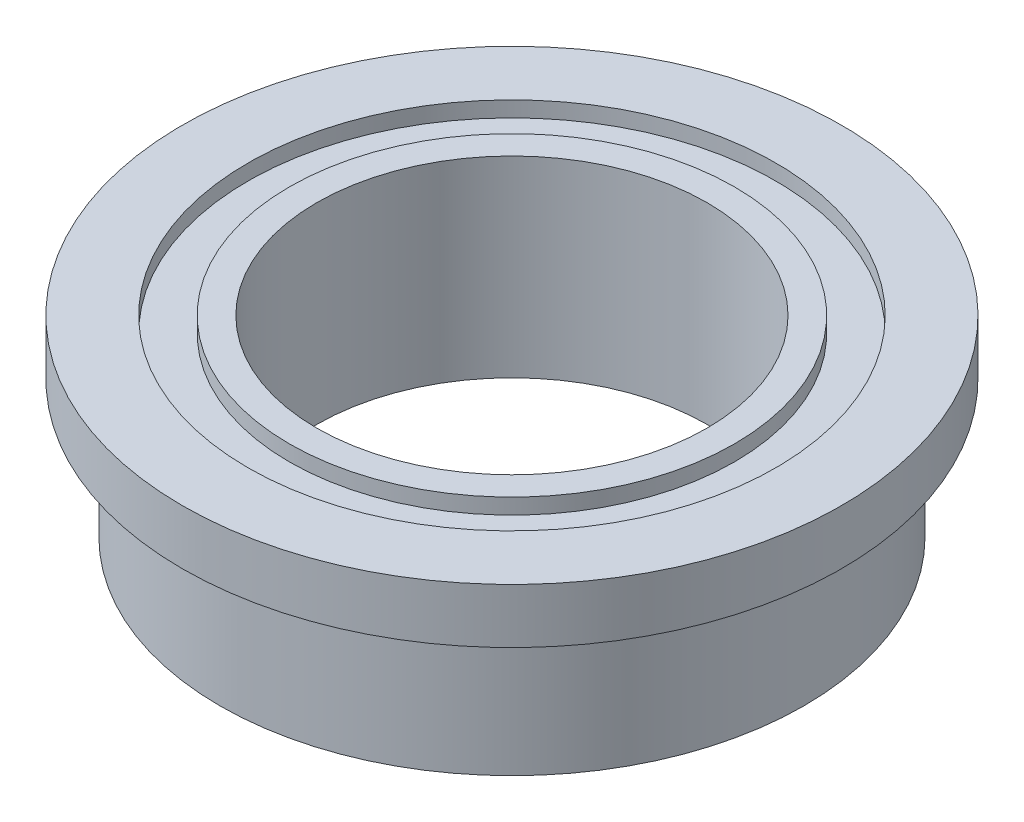
ISO-10303-21;
HEADER;
FILE_DESCRIPTION(('STEP AP214'),'2;1');
FILE_NAME('part.step','',(''),(''),'','','');
FILE_SCHEMA(('AUTOMOTIVE_DESIGN { 1 0 10303 214 1 1 1 1 }'));
ENDSEC;
DATA;
#1=APPLICATION_CONTEXT('core data for automotive mechanical design processes');
#2=APPLICATION_PROTOCOL_DEFINITION('international standard','automotive_design',2000,#1);
#3=PRODUCT_CONTEXT('',#1,'mechanical');
#4=PRODUCT('Part','Part','',(#3));
#5=PRODUCT_RELATED_PRODUCT_CATEGORY('part','',(#4));
#6=PRODUCT_DEFINITION_FORMATION('','',#4);
#7=PRODUCT_DEFINITION_CONTEXT('part definition',#1,'design');
#8=PRODUCT_DEFINITION('design','',#6,#7);
#9=PRODUCT_DEFINITION_SHAPE('','',#8);
#10=(LENGTH_UNIT() NAMED_UNIT(*) SI_UNIT(.MILLI.,.METRE.));
#11=(NAMED_UNIT(*) PLANE_ANGLE_UNIT() SI_UNIT($,.RADIAN.));
#12=(NAMED_UNIT(*) SI_UNIT($,.STERADIAN.) SOLID_ANGLE_UNIT());
#13=UNCERTAINTY_MEASURE_WITH_UNIT(LENGTH_MEASURE(1.E-05),#10,'distance_accuracy_value','');
#14=(GEOMETRIC_REPRESENTATION_CONTEXT(3) GLOBAL_UNCERTAINTY_ASSIGNED_CONTEXT((#13)) GLOBAL_UNIT_ASSIGNED_CONTEXT((#10,
#11,#12)) REPRESENTATION_CONTEXT('',''));
#15=CARTESIAN_POINT('',(0.,0.,0.));
#16=DIRECTION('',(0.,0.,1.));
#17=DIRECTION('',(1.,0.,0.));
#18=AXIS2_PLACEMENT_3D('',#15,#16,#17);
#19=CARTESIAN_POINT('',(0.,0.,0.));
#20=DIRECTION('',(0.,1.,0.));
#21=DIRECTION('',(0.,0.,1.));
#22=AXIS2_PLACEMENT_3D('',#19,#20,#21);
#23=CYLINDRICAL_SURFACE('',#22,3.175);
#24=CARTESIAN_POINT('',(0.,3.1242,0.));
#25=DIRECTION('',(0.,1.,0.));
#26=DIRECTION('',(0.,0.,1.));
#27=AXIS2_PLACEMENT_3D('',#24,#25,#26);
#28=CIRCLE('',#27,3.175);
#29=CARTESIAN_POINT('',(0.,3.1242,3.175));
#30=VERTEX_POINT('',#29);
#31=EDGE_CURVE('E10',#30,#30,#28,.T.);
#32=ORIENTED_EDGE('',*,*,#31,.T.);
#33=EDGE_LOOP('',(#32));
#34=FACE_BOUND('',#33,.T.);
#35=CARTESIAN_POINT('',(0.,0.,0.));
#36=DIRECTION('',(0.,1.,0.));
#37=DIRECTION('',(0.,0.,1.));
#38=AXIS2_PLACEMENT_3D('',#35,#36,#37);
#39=CIRCLE('',#38,3.175);
#40=CARTESIAN_POINT('',(0.,0.,3.175));
#41=VERTEX_POINT('',#40);
#42=EDGE_CURVE('E79',#41,#41,#39,.T.);
#43=ORIENTED_EDGE('',*,*,#42,.F.);
#44=EDGE_LOOP('',(#43));
#45=FACE_BOUND('',#44,.T.);
#46=ADVANCED_FACE('F33',(#34,#45),#23,.F.);
#47=CARTESIAN_POINT('',(3.175,3.1242,0.));
#48=DIRECTION('',(0.,1.,0.));
#49=DIRECTION('',(0.,0.,1.));
#50=AXIS2_PLACEMENT_3D('',#47,#48,#49);
#51=PLANE('',#50);
#52=CARTESIAN_POINT('',(0.,3.1242,0.));
#53=DIRECTION('',(0.,1.,0.));
#54=DIRECTION('',(0.,0.,1.));
#55=AXIS2_PLACEMENT_3D('',#52,#53,#54);
#56=CIRCLE('',#55,3.6195);
#57=CARTESIAN_POINT('',(0.,3.1242,3.6195));
#58=VERTEX_POINT('',#57);
#59=EDGE_CURVE('E39',#58,#58,#56,.T.);
#60=ORIENTED_EDGE('',*,*,#59,.T.);
#61=EDGE_LOOP('',(#60));
#62=FACE_BOUND('',#61,.T.);
#63=ORIENTED_EDGE('',*,*,#31,.F.);
#64=EDGE_LOOP('',(#63));
#65=FACE_BOUND('',#64,.T.);
#66=ADVANCED_FACE('F87',(#62,#65),#51,.T.);
#67=CARTESIAN_POINT('',(0.,0.,0.));
#68=DIRECTION('',(0.,1.,0.));
#69=DIRECTION('',(0.,0.,1.));
#70=AXIS2_PLACEMENT_3D('',#67,#68,#69);
#71=CYLINDRICAL_SURFACE('',#70,3.6195);
#72=CARTESIAN_POINT('',(0.,2.8702,0.));
#73=DIRECTION('',(0.,1.,0.));
#74=DIRECTION('',(0.,0.,1.));
#75=AXIS2_PLACEMENT_3D('',#72,#73,#74);
#76=CIRCLE('',#75,3.6195);
#77=CARTESIAN_POINT('',(0.,2.8702,3.6195));
#78=VERTEX_POINT('',#77);
#79=EDGE_CURVE('E43',#78,#78,#76,.T.);
#80=ORIENTED_EDGE('',*,*,#79,.T.);
#81=EDGE_LOOP('',(#80));
#82=FACE_BOUND('',#81,.T.);
#83=ORIENTED_EDGE('',*,*,#59,.F.);
#84=EDGE_LOOP('',(#83));
#85=FACE_BOUND('',#84,.T.);
#86=ADVANCED_FACE('F91',(#82,#85),#71,.T.);
#87=CARTESIAN_POINT('',(3.6195,2.8702,0.));
#88=DIRECTION('',(0.,1.,0.));
#89=DIRECTION('',(0.,0.,1.));
#90=AXIS2_PLACEMENT_3D('',#87,#88,#89);
#91=PLANE('',#90);
#92=CARTESIAN_POINT('',(0.,2.8702,0.));
#93=DIRECTION('',(0.,1.,0.));
#94=DIRECTION('',(0.,0.,1.));
#95=AXIS2_PLACEMENT_3D('',#92,#93,#94);
#96=CIRCLE('',#95,4.2926);
#97=CARTESIAN_POINT('',(0.,2.8702,4.2926));
#98=VERTEX_POINT('',#97);
#99=EDGE_CURVE('E47',#98,#98,#96,.T.);
#100=ORIENTED_EDGE('',*,*,#99,.T.);
#101=EDGE_LOOP('',(#100));
#102=FACE_BOUND('',#101,.T.);
#103=ORIENTED_EDGE('',*,*,#79,.F.);
#104=EDGE_LOOP('',(#103));
#105=FACE_BOUND('',#104,.T.);
#106=ADVANCED_FACE('F95',(#102,#105),#91,.T.);
#107=CARTESIAN_POINT('',(0.,0.,0.));
#108=DIRECTION('',(0.,1.,0.));
#109=DIRECTION('',(0.,0.,1.));
#110=AXIS2_PLACEMENT_3D('',#107,#108,#109);
#111=CYLINDRICAL_SURFACE('',#110,4.2926);
#112=CARTESIAN_POINT('',(0.,3.1242,0.));
#113=DIRECTION('',(0.,1.,0.));
#114=DIRECTION('',(0.,0.,1.));
#115=AXIS2_PLACEMENT_3D('',#112,#113,#114);
#116=CIRCLE('',#115,4.2926);
#117=CARTESIAN_POINT('',(0.,3.1242,4.2926));
#118=VERTEX_POINT('',#117);
#119=EDGE_CURVE('E52',#118,#118,#116,.T.);
#120=ORIENTED_EDGE('',*,*,#119,.T.);
#121=EDGE_LOOP('',(#120));
#122=FACE_BOUND('',#121,.T.);
#123=ORIENTED_EDGE('',*,*,#99,.F.);
#124=EDGE_LOOP('',(#123));
#125=FACE_BOUND('',#124,.T.);
#126=ADVANCED_FACE('F102',(#122,#125),#111,.F.);
#127=CARTESIAN_POINT('',(4.2926,3.1242,0.));
#128=DIRECTION('',(0.,1.,0.));
#129=DIRECTION('',(0.,0.,1.));
#130=AXIS2_PLACEMENT_3D('',#127,#128,#129);
#131=PLANE('',#130);
#132=CARTESIAN_POINT('',(0.,3.1242,0.));
#133=DIRECTION('',(0.,1.,0.));
#134=DIRECTION('',(0.,0.,1.));
#135=AXIS2_PLACEMENT_3D('',#132,#133,#134);
#136=CIRCLE('',#135,5.3594);
#137=CARTESIAN_POINT('',(0.,3.1242,5.3594));
#138=VERTEX_POINT('',#137);
#139=EDGE_CURVE('E55',#138,#138,#136,.T.);
#140=ORIENTED_EDGE('',*,*,#139,.T.);
#141=EDGE_LOOP('',(#140));
#142=FACE_BOUND('',#141,.T.);
#143=ORIENTED_EDGE('',*,*,#119,.F.);
#144=EDGE_LOOP('',(#143));
#145=FACE_BOUND('',#144,.T.);
#146=ADVANCED_FACE('F106',(#142,#145),#131,.T.);
#147=CARTESIAN_POINT('',(0.,0.,0.));
#148=DIRECTION('',(0.,1.,0.));
#149=DIRECTION('',(0.,0.,1.));
#150=AXIS2_PLACEMENT_3D('',#147,#148,#149);
#151=CYLINDRICAL_SURFACE('',#150,5.3594);
#152=CARTESIAN_POINT('',(0.,2.2352,0.));
#153=DIRECTION('',(0.,1.,0.));
#154=DIRECTION('',(0.,0.,1.));
#155=AXIS2_PLACEMENT_3D('',#152,#153,#154);
#156=CIRCLE('',#155,5.3594);
#157=CARTESIAN_POINT('',(0.,2.2352,5.3594));
#158=VERTEX_POINT('',#157);
#159=EDGE_CURVE('E58',#158,#158,#156,.T.);
#160=ORIENTED_EDGE('',*,*,#159,.T.);
#161=EDGE_LOOP('',(#160));
#162=FACE_BOUND('',#161,.T.);
#163=ORIENTED_EDGE('',*,*,#139,.F.);
#164=EDGE_LOOP('',(#163));
#165=FACE_BOUND('',#164,.T.);
#166=ADVANCED_FACE('F110',(#162,#165),#151,.T.);
#167=CARTESIAN_POINT('',(5.3594,2.2352,0.));
#168=DIRECTION('',(0.,-1.,0.));
#169=DIRECTION('',(0.,0.,-1.));
#170=AXIS2_PLACEMENT_3D('',#167,#168,#169);
#171=PLANE('',#170);
#172=CARTESIAN_POINT('',(0.,2.2352,0.));
#173=DIRECTION('',(0.,1.,0.));
#174=DIRECTION('',(0.,0.,1.));
#175=AXIS2_PLACEMENT_3D('',#172,#173,#174);
#176=CIRCLE('',#175,4.7498);
#177=CARTESIAN_POINT('',(0.,2.2352,4.7498));
#178=VERTEX_POINT('',#177);
#179=EDGE_CURVE('E61',#178,#178,#176,.T.);
#180=ORIENTED_EDGE('',*,*,#179,.T.);
#181=EDGE_LOOP('',(#180));
#182=FACE_BOUND('',#181,.T.);
#183=ORIENTED_EDGE('',*,*,#159,.F.);
#184=EDGE_LOOP('',(#183));
#185=FACE_BOUND('',#184,.T.);
#186=ADVANCED_FACE('F114',(#182,#185),#171,.T.);
#187=CARTESIAN_POINT('',(0.,0.,0.));
#188=DIRECTION('',(0.,1.,0.));
#189=DIRECTION('',(0.,0.,1.));
#190=AXIS2_PLACEMENT_3D('',#187,#188,#189);
#191=CYLINDRICAL_SURFACE('',#190,4.7498);
#192=CARTESIAN_POINT('',(0.,0.,0.));
#193=DIRECTION('',(0.,1.,0.));
#194=DIRECTION('',(0.,0.,1.));
#195=AXIS2_PLACEMENT_3D('',#192,#193,#194);
#196=CIRCLE('',#195,4.7498);
#197=CARTESIAN_POINT('',(0.,0.,4.7498));
#198=VERTEX_POINT('',#197);
#199=EDGE_CURVE('E64',#198,#198,#196,.T.);
#200=ORIENTED_EDGE('',*,*,#199,.T.);
#201=EDGE_LOOP('',(#200));
#202=FACE_BOUND('',#201,.T.);
#203=ORIENTED_EDGE('',*,*,#179,.F.);
#204=EDGE_LOOP('',(#203));
#205=FACE_BOUND('',#204,.T.);
#206=ADVANCED_FACE('F118',(#202,#205),#191,.T.);
#207=CARTESIAN_POINT('',(4.7498,0.,0.));
#208=DIRECTION('',(0.,-1.,0.));
#209=DIRECTION('',(0.,0.,-1.));
#210=AXIS2_PLACEMENT_3D('',#207,#208,#209);
#211=PLANE('',#210);
#212=CARTESIAN_POINT('',(0.,0.,0.));
#213=DIRECTION('',(0.,1.,0.));
#214=DIRECTION('',(0.,0.,1.));
#215=AXIS2_PLACEMENT_3D('',#212,#213,#214);
#216=CIRCLE('',#215,4.2926);
#217=CARTESIAN_POINT('',(0.,0.,4.2926));
#218=VERTEX_POINT('',#217);
#219=EDGE_CURVE('E67',#218,#218,#216,.T.);
#220=ORIENTED_EDGE('',*,*,#219,.T.);
#221=EDGE_LOOP('',(#220));
#222=FACE_BOUND('',#221,.T.);
#223=ORIENTED_EDGE('',*,*,#199,.F.);
#224=EDGE_LOOP('',(#223));
#225=FACE_BOUND('',#224,.T.);
#226=ADVANCED_FACE('F122',(#222,#225),#211,.T.);
#227=CARTESIAN_POINT('',(0.,0.,0.));
#228=DIRECTION('',(0.,1.,0.));
#229=DIRECTION('',(0.,0.,1.));
#230=AXIS2_PLACEMENT_3D('',#227,#228,#229);
#231=CYLINDRICAL_SURFACE('',#230,4.2926);
#232=CARTESIAN_POINT('',(0.,0.254,0.));
#233=DIRECTION('',(0.,1.,0.));
#234=DIRECTION('',(0.,0.,1.));
#235=AXIS2_PLACEMENT_3D('',#232,#233,#234);
#236=CIRCLE('',#235,4.2926);
#237=CARTESIAN_POINT('',(0.,0.254,4.2926));
#238=VERTEX_POINT('',#237);
#239=EDGE_CURVE('E70',#238,#238,#236,.T.);
#240=ORIENTED_EDGE('',*,*,#239,.T.);
#241=EDGE_LOOP('',(#240));
#242=FACE_BOUND('',#241,.T.);
#243=ORIENTED_EDGE('',*,*,#219,.F.);
#244=EDGE_LOOP('',(#243));
#245=FACE_BOUND('',#244,.T.);
#246=ADVANCED_FACE('F126',(#242,#245),#231,.F.);
#247=CARTESIAN_POINT('',(4.2926,0.254,0.));
#248=DIRECTION('',(0.,-1.,0.));
#249=DIRECTION('',(0.,0.,-1.));
#250=AXIS2_PLACEMENT_3D('',#247,#248,#249);
#251=PLANE('',#250);
#252=CARTESIAN_POINT('',(0.,0.254,0.));
#253=DIRECTION('',(0.,1.,0.));
#254=DIRECTION('',(0.,0.,1.));
#255=AXIS2_PLACEMENT_3D('',#252,#253,#254);
#256=CIRCLE('',#255,3.6195);
#257=CARTESIAN_POINT('',(0.,0.254,3.6195));
#258=VERTEX_POINT('',#257);
#259=EDGE_CURVE('E73',#258,#258,#256,.T.);
#260=ORIENTED_EDGE('',*,*,#259,.T.);
#261=EDGE_LOOP('',(#260));
#262=FACE_BOUND('',#261,.T.);
#263=ORIENTED_EDGE('',*,*,#239,.F.);
#264=EDGE_LOOP('',(#263));
#265=FACE_BOUND('',#264,.T.);
#266=ADVANCED_FACE('F130',(#262,#265),#251,.T.);
#267=CARTESIAN_POINT('',(0.,0.,0.));
#268=DIRECTION('',(0.,1.,0.));
#269=DIRECTION('',(0.,0.,1.));
#270=AXIS2_PLACEMENT_3D('',#267,#268,#269);
#271=CYLINDRICAL_SURFACE('',#270,3.6195);
#272=CARTESIAN_POINT('',(0.,0.,0.));
#273=DIRECTION('',(0.,1.,0.));
#274=DIRECTION('',(0.,0.,1.));
#275=AXIS2_PLACEMENT_3D('',#272,#273,#274);
#276=CIRCLE('',#275,3.6195);
#277=CARTESIAN_POINT('',(0.,0.,3.6195));
#278=VERTEX_POINT('',#277);
#279=EDGE_CURVE('E76',#278,#278,#276,.T.);
#280=ORIENTED_EDGE('',*,*,#279,.T.);
#281=EDGE_LOOP('',(#280));
#282=FACE_BOUND('',#281,.T.);
#283=ORIENTED_EDGE('',*,*,#259,.F.);
#284=EDGE_LOOP('',(#283));
#285=FACE_BOUND('',#284,.T.);
#286=ADVANCED_FACE('F134',(#282,#285),#271,.T.);
#287=CARTESIAN_POINT('',(3.6195,0.,0.));
#288=DIRECTION('',(0.,-1.,0.));
#289=DIRECTION('',(0.,0.,-1.));
#290=AXIS2_PLACEMENT_3D('',#287,#288,#289);
#291=PLANE('',#290);
#292=ORIENTED_EDGE('',*,*,#42,.T.);
#293=EDGE_LOOP('',(#292));
#294=FACE_BOUND('',#293,.T.);
#295=ORIENTED_EDGE('',*,*,#279,.F.);
#296=EDGE_LOOP('',(#295));
#297=FACE_BOUND('',#296,.T.);
#298=ADVANCED_FACE('F83',(#294,#297),#291,.T.);
#299=CLOSED_SHELL('',(#46,#66,#86,#106,#126,#146,#166,#186,#206,#226,#246,#266,#286,#298));
#300=MANIFOLD_SOLID_BREP('B2',#299);
#301=ADVANCED_BREP_SHAPE_REPRESENTATION('',(#18,#300),#14);
#302=SHAPE_DEFINITION_REPRESENTATION(#9,#301);
ENDSEC;
END-ISO-10303-21;
